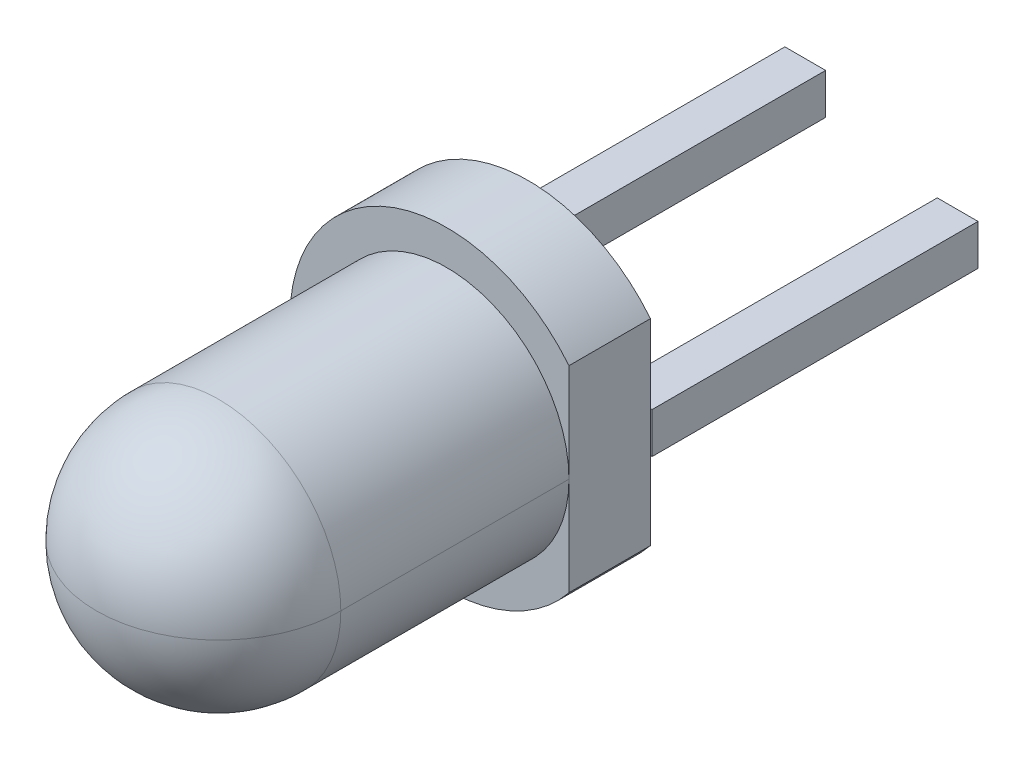
ISO-10303-21;
HEADER;
FILE_DESCRIPTION(('STEP AP214'),'2;1');
FILE_NAME('part.step','',(''),(''),'','','');
FILE_SCHEMA(('AUTOMOTIVE_DESIGN { 1 0 10303 214 1 1 1 1 }'));
ENDSEC;
DATA;
#1=APPLICATION_CONTEXT('core data for automotive mechanical design processes');
#2=APPLICATION_PROTOCOL_DEFINITION('international standard','automotive_design',2000,#1);
#3=PRODUCT_CONTEXT('',#1,'mechanical');
#4=PRODUCT('Part','Part','',(#3));
#5=PRODUCT_RELATED_PRODUCT_CATEGORY('part','',(#4));
#6=PRODUCT_DEFINITION_FORMATION('','',#4);
#7=PRODUCT_DEFINITION_CONTEXT('part definition',#1,'design');
#8=PRODUCT_DEFINITION('design','',#6,#7);
#9=PRODUCT_DEFINITION_SHAPE('','',#8);
#10=(LENGTH_UNIT() NAMED_UNIT(*) SI_UNIT(.MILLI.,.METRE.));
#11=(NAMED_UNIT(*) PLANE_ANGLE_UNIT() SI_UNIT($,.RADIAN.));
#12=(NAMED_UNIT(*) SI_UNIT($,.STERADIAN.) SOLID_ANGLE_UNIT());
#13=UNCERTAINTY_MEASURE_WITH_UNIT(LENGTH_MEASURE(1.E-05),#10,'distance_accuracy_value','');
#14=(GEOMETRIC_REPRESENTATION_CONTEXT(3) GLOBAL_UNCERTAINTY_ASSIGNED_CONTEXT((#13)) GLOBAL_UNIT_ASSIGNED_CONTEXT((#10,
#11,#12)) REPRESENTATION_CONTEXT('',''));
#15=CARTESIAN_POINT('',(0.,0.,0.));
#16=DIRECTION('',(0.,0.,1.));
#17=DIRECTION('',(1.,0.,0.));
#18=AXIS2_PLACEMENT_3D('',#15,#16,#17);
#19=CARTESIAN_POINT('',(-0.895,-0.25,-4.67));
#20=DIRECTION('',(0.,0.,-1.));
#21=DIRECTION('',(0.,-1.,0.));
#22=AXIS2_PLACEMENT_3D('',#19,#20,#21);
#23=PLANE('',#22);
#24=DIRECTION('',(1.,0.,0.));
#25=VECTOR('',#24,1.);
#26=CARTESIAN_POINT('',(-0.895,-0.25,-4.67));
#27=LINE('',#26,#25);
#28=CARTESIAN_POINT('',(-1.52,-0.25,-4.67));
#29=VERTEX_POINT('',#28);
#30=CARTESIAN_POINT('',(-1.02,-0.25,-4.67));
#31=VERTEX_POINT('',#30);
#32=EDGE_CURVE('E153',#29,#31,#27,.T.);
#33=ORIENTED_EDGE('',*,*,#32,.F.);
#34=DIRECTION('',(0.,-1.,0.));
#35=VECTOR('',#34,1.);
#36=CARTESIAN_POINT('',(-1.52,0.25,-4.67));
#37=LINE('',#36,#35);
#38=CARTESIAN_POINT('',(-1.52,0.25,-4.67));
#39=VERTEX_POINT('',#38);
#40=EDGE_CURVE('E137',#39,#29,#37,.T.);
#41=ORIENTED_EDGE('',*,*,#40,.F.);
#42=DIRECTION('',(-1.,0.,0.));
#43=VECTOR('',#42,1.);
#44=CARTESIAN_POINT('',(-0.895,0.25,-4.67));
#45=LINE('',#44,#43);
#46=CARTESIAN_POINT('',(-1.02,0.25,-4.67));
#47=VERTEX_POINT('',#46);
#48=EDGE_CURVE('E196',#47,#39,#45,.T.);
#49=ORIENTED_EDGE('',*,*,#48,.F.);
#50=DIRECTION('',(0.,1.,0.));
#51=VECTOR('',#50,1.);
#52=CARTESIAN_POINT('',(-1.02,-0.25,-4.67));
#53=LINE('',#52,#51);
#54=EDGE_CURVE('E138',#31,#47,#53,.T.);
#55=ORIENTED_EDGE('',*,*,#54,.F.);
#56=EDGE_LOOP('',(#33,#41,#49,#55));
#57=FACE_BOUND('',#56,.T.);
#58=ADVANCED_FACE('F16',(#57),#23,.T.);
#59=CARTESIAN_POINT('',(0.,0.,-4.));
#60=DIRECTION('',(0.,0.,-1.));
#61=DIRECTION('',(0.,-1.,0.));
#62=AXIS2_PLACEMENT_3D('',#59,#60,#61);
#63=PLANE('',#62);
#64=DIRECTION('',(0.,-1.,0.));
#65=VECTOR('',#64,1.);
#66=CARTESIAN_POINT('',(1.52,0.25,-4.));
#67=LINE('',#66,#65);
#68=CARTESIAN_POINT('',(1.52,0.25,-4.));
#69=VERTEX_POINT('',#68);
#70=CARTESIAN_POINT('',(1.52,-0.25,-4.));
#71=VERTEX_POINT('',#70);
#72=EDGE_CURVE('E149',#69,#71,#67,.T.);
#73=ORIENTED_EDGE('',*,*,#72,.T.);
#74=DIRECTION('',(1.,0.,0.));
#75=VECTOR('',#74,1.);
#76=CARTESIAN_POINT('',(1.645,-0.25,-4.));
#77=LINE('',#76,#75);
#78=CARTESIAN_POINT('',(1.02,-0.25,-4.));
#79=VERTEX_POINT('',#78);
#80=EDGE_CURVE('E173',#79,#71,#77,.T.);
#81=ORIENTED_EDGE('',*,*,#80,.F.);
#82=DIRECTION('',(0.,1.,0.));
#83=VECTOR('',#82,1.);
#84=CARTESIAN_POINT('',(1.02,-0.25,-4.));
#85=LINE('',#84,#83);
#86=CARTESIAN_POINT('',(1.02,0.25,-4.));
#87=VERTEX_POINT('',#86);
#88=EDGE_CURVE('E215',#79,#87,#85,.T.);
#89=ORIENTED_EDGE('',*,*,#88,.T.);
#90=DIRECTION('',(1.,0.,0.));
#91=VECTOR('',#90,1.);
#92=CARTESIAN_POINT('',(1.02,0.25,-4.));
#93=LINE('',#92,#91);
#94=EDGE_CURVE('E216',#87,#69,#93,.T.);
#95=ORIENTED_EDGE('',*,*,#94,.T.);
#96=EDGE_LOOP('',(#73,#81,#89,#95));
#97=FACE_BOUND('',#96,.T.);
#98=ADVANCED_FACE('F329',(#97),#63,.T.);
#99=CARTESIAN_POINT('',(0.,0.,3.8));
#100=DIRECTION('',(0.,1.,0.));
#101=DIRECTION('',(1.,0.,0.));
#102=AXIS2_PLACEMENT_3D('',#99,#100,#101);
#103=SPHERICAL_SURFACE('',#102,1.5);
#104=CARTESIAN_POINT('',(0.,0.,3.8));
#105=DIRECTION('',(0.,1.,0.));
#106=DIRECTION('',(-1.,0.,0.));
#107=AXIS2_PLACEMENT_3D('',#104,#105,#106);
#108=CIRCLE('',#107,1.5);
#109=CARTESIAN_POINT('',(-1.5,0.,3.8));
#110=VERTEX_POINT('',#109);
#111=CARTESIAN_POINT('',(0.,0.,5.3));
#112=VERTEX_POINT('',#111);
#113=EDGE_CURVE('E182',#110,#112,#108,.T.);
#114=ORIENTED_EDGE('',*,*,#113,.F.);
#115=CARTESIAN_POINT('',(0.,0.,3.8));
#116=DIRECTION('',(0.,0.,-1.));
#117=DIRECTION('',(-1.,0.,0.));
#118=AXIS2_PLACEMENT_3D('',#115,#116,#117);
#119=CIRCLE('',#118,1.5);
#120=CARTESIAN_POINT('',(1.5,0.,3.8));
#121=VERTEX_POINT('',#120);
#122=EDGE_CURVE('E207',#121,#110,#119,.T.);
#123=ORIENTED_EDGE('',*,*,#122,.F.);
#124=CARTESIAN_POINT('',(0.,0.,3.8));
#125=DIRECTION('',(0.,-1.,0.));
#126=DIRECTION('',(0.,0.,-1.));
#127=AXIS2_PLACEMENT_3D('',#124,#125,#126);
#128=CIRCLE('',#127,1.5);
#129=EDGE_CURVE('E186',#121,#112,#128,.T.);
#130=ORIENTED_EDGE('',*,*,#129,.T.);
#131=EDGE_LOOP('',(#114,#123,#130));
#132=FACE_BOUND('',#131,.T.);
#133=ADVANCED_FACE('F374',(#132),#103,.T.);
#134=CARTESIAN_POINT('',(0.,0.,0.));
#135=DIRECTION('',(0.,0.,-1.));
#136=DIRECTION('',(0.,-1.,0.));
#137=AXIS2_PLACEMENT_3D('',#134,#135,#136);
#138=PLANE('',#137);
#139=DIRECTION('',(0.,-1.,0.));
#140=VECTOR('',#139,1.);
#141=CARTESIAN_POINT('',(-1.52,0.25,0.));
#142=LINE('',#141,#140);
#143=CARTESIAN_POINT('',(-1.52,0.25,0.));
#144=VERTEX_POINT('',#143);
#145=CARTESIAN_POINT('',(-1.52,-0.25,0.));
#146=VERTEX_POINT('',#145);
#147=EDGE_CURVE('E144',#144,#146,#142,.T.);
#148=ORIENTED_EDGE('',*,*,#147,.T.);
#149=DIRECTION('',(1.,0.,0.));
#150=VECTOR('',#149,1.);
#151=CARTESIAN_POINT('',(-1.52,-0.25,0.));
#152=LINE('',#151,#150);
#153=CARTESIAN_POINT('',(-1.02,-0.25,0.));
#154=VERTEX_POINT('',#153);
#155=EDGE_CURVE('E141',#146,#154,#152,.T.);
#156=ORIENTED_EDGE('',*,*,#155,.T.);
#157=DIRECTION('',(0.,1.,0.));
#158=VECTOR('',#157,1.);
#159=CARTESIAN_POINT('',(-1.02,-0.25,0.));
#160=LINE('',#159,#158);
#161=CARTESIAN_POINT('',(-1.02,0.25,0.));
#162=VERTEX_POINT('',#161);
#163=EDGE_CURVE('E125',#154,#162,#160,.T.);
#164=ORIENTED_EDGE('',*,*,#163,.T.);
#165=DIRECTION('',(-1.,0.,0.));
#166=VECTOR('',#165,1.);
#167=CARTESIAN_POINT('',(-1.02,0.25,0.));
#168=LINE('',#167,#166);
#169=EDGE_CURVE('E168',#162,#144,#168,.T.);
#170=ORIENTED_EDGE('',*,*,#169,.T.);
#171=EDGE_LOOP('',(#148,#156,#164,#170));
#172=FACE_BOUND('',#171,.T.);
#173=DIRECTION('',(1.,0.,0.));
#174=VECTOR('',#173,1.);
#175=CARTESIAN_POINT('',(1.02,0.25,0.));
#176=LINE('',#175,#174);
#177=CARTESIAN_POINT('',(1.02,0.25,0.));
#178=VERTEX_POINT('',#177);
#179=CARTESIAN_POINT('',(1.5,0.25,0.));
#180=VERTEX_POINT('',#179);
#181=EDGE_CURVE('E219',#178,#180,#176,.T.);
#182=ORIENTED_EDGE('',*,*,#181,.F.);
#183=DIRECTION('',(0.,1.,0.));
#184=VECTOR('',#183,1.);
#185=CARTESIAN_POINT('',(1.02,-0.25,0.));
#186=LINE('',#185,#184);
#187=CARTESIAN_POINT('',(1.02,-0.25,0.));
#188=VERTEX_POINT('',#187);
#189=EDGE_CURVE('E239',#188,#178,#186,.T.);
#190=ORIENTED_EDGE('',*,*,#189,.F.);
#191=DIRECTION('',(-1.,0.,0.));
#192=VECTOR('',#191,1.);
#193=CARTESIAN_POINT('',(1.52,-0.25,0.));
#194=LINE('',#193,#192);
#195=CARTESIAN_POINT('',(1.5,-0.25,0.));
#196=VERTEX_POINT('',#195);
#197=EDGE_CURVE('E206',#196,#188,#194,.T.);
#198=ORIENTED_EDGE('',*,*,#197,.F.);
#199=DIRECTION('',(0.,-1.,0.));
#200=VECTOR('',#199,1.);
#201=CARTESIAN_POINT('',(1.5,0.,0.));
#202=LINE('',#201,#200);
#203=CARTESIAN_POINT('',(1.5,-1.20649285120137,0.));
#204=VERTEX_POINT('',#203);
#205=EDGE_CURVE('E10',#196,#204,#202,.T.);
#206=ORIENTED_EDGE('',*,*,#205,.T.);
#207=CARTESIAN_POINT('',(0.,0.,0.));
#208=DIRECTION('',(0.,0.,-1.));
#209=DIRECTION('',(1.,0.,0.));
#210=AXIS2_PLACEMENT_3D('',#207,#208,#209);
#211=CIRCLE('',#210,1.925);
#212=CARTESIAN_POINT('',(-1.925,0.,0.));
#213=VERTEX_POINT('',#212);
#214=EDGE_CURVE('E230',#204,#213,#211,.T.);
#215=ORIENTED_EDGE('',*,*,#214,.T.);
#216=CARTESIAN_POINT('',(0.,0.,0.));
#217=DIRECTION('',(0.,0.,-1.));
#218=DIRECTION('',(1.,0.,0.));
#219=AXIS2_PLACEMENT_3D('',#216,#217,#218);
#220=CIRCLE('',#219,1.925);
#221=CARTESIAN_POINT('',(1.5,1.20649285120137,0.));
#222=VERTEX_POINT('',#221);
#223=EDGE_CURVE('E252',#213,#222,#220,.T.);
#224=ORIENTED_EDGE('',*,*,#223,.T.);
#225=DIRECTION('',(0.,-1.,0.));
#226=VECTOR('',#225,1.);
#227=CARTESIAN_POINT('',(1.5,0.,0.));
#228=LINE('',#227,#226);
#229=EDGE_CURVE('E27',#222,#180,#228,.T.);
#230=ORIENTED_EDGE('',*,*,#229,.T.);
#231=EDGE_LOOP('',(#182,#190,#198,#206,#215,#224,#230));
#232=FACE_BOUND('',#231,.T.);
#233=ADVANCED_FACE('F142',(#172,#232),#138,.T.);
#234=CARTESIAN_POINT('',(1.5,1.925,5.53579262617378));
#235=DIRECTION('',(1.,0.,0.));
#236=DIRECTION('',(0.,1.,0.));
#237=AXIS2_PLACEMENT_3D('',#234,#235,#236);
#238=PLANE('',#237);
#239=ORIENTED_EDGE('',*,*,#229,.F.);
#240=DIRECTION('',(0.,0.,-1.));
#241=VECTOR('',#240,1.);
#242=CARTESIAN_POINT('',(1.5,1.20649285120137,1.));
#243=LINE('',#242,#241);
#244=CARTESIAN_POINT('',(1.5,1.20649285120137,1.));
#245=VERTEX_POINT('',#244);
#246=EDGE_CURVE('E193',#245,#222,#243,.T.);
#247=ORIENTED_EDGE('',*,*,#246,.F.);
#248=DIRECTION('',(0.,-1.,0.));
#249=VECTOR('',#248,1.);
#250=CARTESIAN_POINT('',(1.5,0.,1.));
#251=LINE('',#250,#249);
#252=CARTESIAN_POINT('',(1.5,0.,1.));
#253=VERTEX_POINT('',#252);
#254=EDGE_CURVE('E226',#245,#253,#251,.T.);
#255=ORIENTED_EDGE('',*,*,#254,.T.);
#256=DIRECTION('',(0.,-1.,0.));
#257=VECTOR('',#256,1.);
#258=CARTESIAN_POINT('',(1.5,0.,1.));
#259=LINE('',#258,#257);
#260=CARTESIAN_POINT('',(1.5,-1.20649285120137,1.));
#261=VERTEX_POINT('',#260);
#262=EDGE_CURVE('E229',#253,#261,#259,.T.);
#263=ORIENTED_EDGE('',*,*,#262,.T.);
#264=DIRECTION('',(0.,0.,1.));
#265=VECTOR('',#264,1.);
#266=CARTESIAN_POINT('',(1.5,-1.20649285120137,1.));
#267=LINE('',#266,#265);
#268=EDGE_CURVE('E232',#204,#261,#267,.T.);
#269=ORIENTED_EDGE('',*,*,#268,.F.);
#270=ORIENTED_EDGE('',*,*,#205,.F.);
#271=DIRECTION('',(0.,-1.,0.));
#272=VECTOR('',#271,1.);
#273=CARTESIAN_POINT('',(1.5,0.,0.));
#274=LINE('',#273,#272);
#275=EDGE_CURVE('E221',#180,#196,#274,.T.);
#276=ORIENTED_EDGE('',*,*,#275,.F.);
#277=EDGE_LOOP('',(#239,#247,#255,#263,#269,#270,#276));
#278=FACE_BOUND('',#277,.T.);
#279=ADVANCED_FACE('F320',(#278),#238,.T.);
#280=CARTESIAN_POINT('',(0.,0.,1.));
#281=DIRECTION('',(0.,0.,1.));
#282=DIRECTION('',(-1.,0.,0.));
#283=AXIS2_PLACEMENT_3D('',#280,#281,#282);
#284=CYLINDRICAL_SURFACE('',#283,1.925);
#285=DIRECTION('',(0.,0.,1.));
#286=VECTOR('',#285,1.);
#287=CARTESIAN_POINT('',(-1.925,0.,1.));
#288=LINE('',#287,#286);
#289=CARTESIAN_POINT('',(-1.925,0.,1.));
#290=VERTEX_POINT('',#289);
#291=EDGE_CURVE('E248',#213,#290,#288,.T.);
#292=ORIENTED_EDGE('',*,*,#291,.F.);
#293=ORIENTED_EDGE('',*,*,#214,.F.);
#294=ORIENTED_EDGE('',*,*,#268,.T.);
#295=CARTESIAN_POINT('',(0.,0.,1.));
#296=DIRECTION('',(0.,0.,-1.));
#297=DIRECTION('',(1.,0.,0.));
#298=AXIS2_PLACEMENT_3D('',#295,#296,#297);
#299=CIRCLE('',#298,1.925);
#300=EDGE_CURVE('E20',#261,#290,#299,.T.);
#301=ORIENTED_EDGE('',*,*,#300,.T.);
#302=EDGE_LOOP('',(#292,#293,#294,#301));
#303=FACE_BOUND('',#302,.T.);
#304=ADVANCED_FACE('F380',(#303),#284,.T.);
#305=CARTESIAN_POINT('',(0.,0.,1.));
#306=DIRECTION('',(0.,0.,-1.));
#307=DIRECTION('',(0.,-1.,0.));
#308=AXIS2_PLACEMENT_3D('',#305,#306,#307);
#309=PLANE('',#308);
#310=ORIENTED_EDGE('',*,*,#262,.F.);
#311=CARTESIAN_POINT('',(0.,0.,1.));
#312=DIRECTION('',(0.,0.,-1.));
#313=DIRECTION('',(0.,1.,0.));
#314=AXIS2_PLACEMENT_3D('',#311,#312,#313);
#315=CIRCLE('',#314,1.5);
#316=CARTESIAN_POINT('',(-1.5,0.,1.));
#317=VERTEX_POINT('',#316);
#318=EDGE_CURVE('E188',#253,#317,#315,.T.);
#319=ORIENTED_EDGE('',*,*,#318,.T.);
#320=CARTESIAN_POINT('',(0.,0.,1.));
#321=DIRECTION('',(0.,0.,-1.));
#322=DIRECTION('',(0.,1.,0.));
#323=AXIS2_PLACEMENT_3D('',#320,#321,#322);
#324=CIRCLE('',#323,1.5);
#325=EDGE_CURVE('E225',#317,#253,#324,.T.);
#326=ORIENTED_EDGE('',*,*,#325,.T.);
#327=ORIENTED_EDGE('',*,*,#254,.F.);
#328=CARTESIAN_POINT('',(0.,0.,1.));
#329=DIRECTION('',(0.,0.,-1.));
#330=DIRECTION('',(1.,0.,0.));
#331=AXIS2_PLACEMENT_3D('',#328,#329,#330);
#332=CIRCLE('',#331,1.925);
#333=EDGE_CURVE('E165',#290,#245,#332,.T.);
#334=ORIENTED_EDGE('',*,*,#333,.F.);
#335=ORIENTED_EDGE('',*,*,#300,.F.);
#336=EDGE_LOOP('',(#310,#319,#326,#327,#334,#335));
#337=FACE_BOUND('',#336,.T.);
#338=ADVANCED_FACE('F382',(#337),#309,.F.);
#339=CARTESIAN_POINT('',(0.,0.,5.3));
#340=DIRECTION('',(0.,0.,1.));
#341=DIRECTION('',(-1.,0.,0.));
#342=AXIS2_PLACEMENT_3D('',#339,#340,#341);
#343=CYLINDRICAL_SURFACE('',#342,1.5);
#344=DIRECTION('',(0.,0.,1.));
#345=VECTOR('',#344,1.);
#346=CARTESIAN_POINT('',(1.5,0.,5.3));
#347=LINE('',#346,#345);
#348=EDGE_CURVE('E192',#253,#121,#347,.T.);
#349=ORIENTED_EDGE('',*,*,#348,.F.);
#350=ORIENTED_EDGE('',*,*,#325,.F.);
#351=DIRECTION('',(0.,0.,1.));
#352=VECTOR('',#351,1.);
#353=CARTESIAN_POINT('',(-1.5,0.,5.3));
#354=LINE('',#353,#352);
#355=EDGE_CURVE('E197',#317,#110,#354,.T.);
#356=ORIENTED_EDGE('',*,*,#355,.T.);
#357=CARTESIAN_POINT('',(0.,0.,3.8));
#358=DIRECTION('',(0.,0.,-1.));
#359=DIRECTION('',(-1.,0.,0.));
#360=AXIS2_PLACEMENT_3D('',#357,#358,#359);
#361=CIRCLE('',#360,1.5);
#362=EDGE_CURVE('E187',#110,#121,#361,.T.);
#363=ORIENTED_EDGE('',*,*,#362,.T.);
#364=EDGE_LOOP('',(#349,#350,#356,#363));
#365=FACE_BOUND('',#364,.T.);
#366=ADVANCED_FACE('F385',(#365),#343,.T.);
#367=CARTESIAN_POINT('',(1.52,-0.25,0.));
#368=DIRECTION('',(0.,0.,-1.));
#369=DIRECTION('',(0.,-1.,0.));
#370=AXIS2_PLACEMENT_3D('',#367,#368,#369);
#371=PLANE('',#370);
#372=DIRECTION('',(1.,0.,0.));
#373=VECTOR('',#372,1.);
#374=CARTESIAN_POINT('',(1.02,0.25,0.));
#375=LINE('',#374,#373);
#376=CARTESIAN_POINT('',(1.52,0.25,0.));
#377=VERTEX_POINT('',#376);
#378=EDGE_CURVE('E258',#180,#377,#375,.T.);
#379=ORIENTED_EDGE('',*,*,#378,.F.);
#380=ORIENTED_EDGE('',*,*,#275,.T.);
#381=DIRECTION('',(-1.,0.,0.));
#382=VECTOR('',#381,1.);
#383=CARTESIAN_POINT('',(1.52,-0.25,0.));
#384=LINE('',#383,#382);
#385=CARTESIAN_POINT('',(1.52,-0.25,0.));
#386=VERTEX_POINT('',#385);
#387=EDGE_CURVE('E202',#386,#196,#384,.T.);
#388=ORIENTED_EDGE('',*,*,#387,.F.);
#389=DIRECTION('',(0.,-1.,0.));
#390=VECTOR('',#389,1.);
#391=CARTESIAN_POINT('',(1.52,0.25,0.));
#392=LINE('',#391,#390);
#393=EDGE_CURVE('E174',#377,#386,#392,.T.);
#394=ORIENTED_EDGE('',*,*,#393,.F.);
#395=EDGE_LOOP('',(#379,#380,#388,#394));
#396=FACE_BOUND('',#395,.T.);
#397=ADVANCED_FACE('F323',(#396),#371,.F.);
#398=CARTESIAN_POINT('',(-1.52,0.25,-26.4));
#399=DIRECTION('',(-1.,0.,0.));
#400=DIRECTION('',(0.,0.,1.));
#401=AXIS2_PLACEMENT_3D('',#398,#399,#400);
#402=PLANE('',#401);
#403=DIRECTION('',(0.,0.,1.));
#404=VECTOR('',#403,1.);
#405=CARTESIAN_POINT('',(-1.52,0.25,-26.4));
#406=LINE('',#405,#404);
#407=EDGE_CURVE('E201',#39,#144,#406,.T.);
#408=ORIENTED_EDGE('',*,*,#407,.F.);
#409=ORIENTED_EDGE('',*,*,#40,.T.);
#410=DIRECTION('',(0.,0.,1.));
#411=VECTOR('',#410,1.);
#412=CARTESIAN_POINT('',(-1.52,-0.25,-26.4));
#413=LINE('',#412,#411);
#414=EDGE_CURVE('E161',#29,#146,#413,.T.);
#415=ORIENTED_EDGE('',*,*,#414,.T.);
#416=ORIENTED_EDGE('',*,*,#147,.F.);
#417=EDGE_LOOP('',(#408,#409,#415,#416));
#418=FACE_BOUND('',#417,.T.);
#419=ADVANCED_FACE('F352',(#418),#402,.T.);
#420=CARTESIAN_POINT('',(-1.02,-0.25,-26.4));
#421=DIRECTION('',(1.,0.,0.));
#422=DIRECTION('',(0.,1.,0.));
#423=AXIS2_PLACEMENT_3D('',#420,#421,#422);
#424=PLANE('',#423);
#425=DIRECTION('',(0.,0.,1.));
#426=VECTOR('',#425,1.);
#427=CARTESIAN_POINT('',(-1.02,-0.25,-26.4));
#428=LINE('',#427,#426);
#429=EDGE_CURVE('E129',#31,#154,#428,.T.);
#430=ORIENTED_EDGE('',*,*,#429,.F.);
#431=ORIENTED_EDGE('',*,*,#54,.T.);
#432=DIRECTION('',(0.,0.,1.));
#433=VECTOR('',#432,1.);
#434=CARTESIAN_POINT('',(-1.02,0.25,-26.4));
#435=LINE('',#434,#433);
#436=EDGE_CURVE('E132',#47,#162,#435,.T.);
#437=ORIENTED_EDGE('',*,*,#436,.T.);
#438=ORIENTED_EDGE('',*,*,#163,.F.);
#439=EDGE_LOOP('',(#430,#431,#437,#438));
#440=FACE_BOUND('',#439,.T.);
#441=ADVANCED_FACE('F127',(#440),#424,.T.);
#442=CARTESIAN_POINT('',(1.02,0.25,-26.4));
#443=DIRECTION('',(0.,-1.,0.));
#444=DIRECTION('',(0.,0.,-1.));
#445=AXIS2_PLACEMENT_3D('',#442,#443,#444);
#446=PLANE('',#445);
#447=ORIENTED_EDGE('',*,*,#94,.F.);
#448=DIRECTION('',(0.,0.,1.));
#449=VECTOR('',#448,1.);
#450=CARTESIAN_POINT('',(1.02,0.25,-26.4));
#451=LINE('',#450,#449);
#452=EDGE_CURVE('E220',#87,#178,#451,.T.);
#453=ORIENTED_EDGE('',*,*,#452,.T.);
#454=ORIENTED_EDGE('',*,*,#181,.T.);
#455=ORIENTED_EDGE('',*,*,#378,.T.);
#456=DIRECTION('',(0.,0.,1.));
#457=VECTOR('',#456,1.);
#458=CARTESIAN_POINT('',(1.52,0.25,-26.4));
#459=LINE('',#458,#457);
#460=EDGE_CURVE('E178',#69,#377,#459,.T.);
#461=ORIENTED_EDGE('',*,*,#460,.F.);
#462=EDGE_LOOP('',(#447,#453,#454,#455,#461));
#463=FACE_BOUND('',#462,.T.);
#464=ADVANCED_FACE('F310',(#463),#446,.F.);
#465=CARTESIAN_POINT('',(1.02,-0.25,-26.4));
#466=DIRECTION('',(1.,0.,0.));
#467=DIRECTION('',(0.,1.,0.));
#468=AXIS2_PLACEMENT_3D('',#465,#466,#467);
#469=PLANE('',#468);
#470=ORIENTED_EDGE('',*,*,#88,.F.);
#471=DIRECTION('',(0.,0.,1.));
#472=VECTOR('',#471,1.);
#473=CARTESIAN_POINT('',(1.02,-0.25,-26.4));
#474=LINE('',#473,#472);
#475=EDGE_CURVE('E211',#79,#188,#474,.T.);
#476=ORIENTED_EDGE('',*,*,#475,.T.);
#477=ORIENTED_EDGE('',*,*,#189,.T.);
#478=ORIENTED_EDGE('',*,*,#452,.F.);
#479=EDGE_LOOP('',(#470,#476,#477,#478));
#480=FACE_BOUND('',#479,.T.);
#481=ADVANCED_FACE('F313',(#480),#469,.F.);
#482=CARTESIAN_POINT('',(1.52,-0.25,-26.4));
#483=DIRECTION('',(0.,1.,0.));
#484=DIRECTION('',(1.,0.,0.));
#485=AXIS2_PLACEMENT_3D('',#482,#483,#484);
#486=PLANE('',#485);
#487=ORIENTED_EDGE('',*,*,#80,.T.);
#488=DIRECTION('',(0.,0.,1.));
#489=VECTOR('',#488,1.);
#490=CARTESIAN_POINT('',(1.52,-0.25,-26.4));
#491=LINE('',#490,#489);
#492=EDGE_CURVE('E169',#71,#386,#491,.T.);
#493=ORIENTED_EDGE('',*,*,#492,.T.);
#494=ORIENTED_EDGE('',*,*,#387,.T.);
#495=ORIENTED_EDGE('',*,*,#197,.T.);
#496=ORIENTED_EDGE('',*,*,#475,.F.);
#497=EDGE_LOOP('',(#487,#493,#494,#495,#496));
#498=FACE_BOUND('',#497,.T.);
#499=ADVANCED_FACE('F333',(#498),#486,.F.);
#500=CARTESIAN_POINT('',(1.52,0.25,-26.4));
#501=DIRECTION('',(-1.,0.,0.));
#502=DIRECTION('',(0.,0.,1.));
#503=AXIS2_PLACEMENT_3D('',#500,#501,#502);
#504=PLANE('',#503);
#505=ORIENTED_EDGE('',*,*,#72,.F.);
#506=ORIENTED_EDGE('',*,*,#460,.T.);
#507=ORIENTED_EDGE('',*,*,#393,.T.);
#508=ORIENTED_EDGE('',*,*,#492,.F.);
#509=EDGE_LOOP('',(#505,#506,#507,#508));
#510=FACE_BOUND('',#509,.T.);
#511=ADVANCED_FACE('F18',(#510),#504,.F.);
#512=CARTESIAN_POINT('',(-1.52,-0.25,-26.4));
#513=DIRECTION('',(0.,-1.,0.));
#514=DIRECTION('',(0.,0.,-1.));
#515=AXIS2_PLACEMENT_3D('',#512,#513,#514);
#516=PLANE('',#515);
#517=ORIENTED_EDGE('',*,*,#414,.F.);
#518=ORIENTED_EDGE('',*,*,#32,.T.);
#519=ORIENTED_EDGE('',*,*,#429,.T.);
#520=ORIENTED_EDGE('',*,*,#155,.F.);
#521=EDGE_LOOP('',(#517,#518,#519,#520));
#522=FACE_BOUND('',#521,.T.);
#523=ADVANCED_FACE('F151',(#522),#516,.T.);
#524=CARTESIAN_POINT('',(-1.02,0.25,-26.4));
#525=DIRECTION('',(0.,1.,0.));
#526=DIRECTION('',(1.,0.,0.));
#527=AXIS2_PLACEMENT_3D('',#524,#525,#526);
#528=PLANE('',#527);
#529=ORIENTED_EDGE('',*,*,#436,.F.);
#530=ORIENTED_EDGE('',*,*,#48,.T.);
#531=ORIENTED_EDGE('',*,*,#407,.T.);
#532=ORIENTED_EDGE('',*,*,#169,.F.);
#533=EDGE_LOOP('',(#529,#530,#531,#532));
#534=FACE_BOUND('',#533,.T.);
#535=ADVANCED_FACE('F354',(#534),#528,.T.);
#536=CARTESIAN_POINT('',(0.,0.,5.3));
#537=DIRECTION('',(0.,0.,1.));
#538=DIRECTION('',(-1.,0.,0.));
#539=AXIS2_PLACEMENT_3D('',#536,#537,#538);
#540=CYLINDRICAL_SURFACE('',#539,1.5);
#541=ORIENTED_EDGE('',*,*,#318,.F.);
#542=ORIENTED_EDGE('',*,*,#348,.T.);
#543=ORIENTED_EDGE('',*,*,#122,.T.);
#544=ORIENTED_EDGE('',*,*,#355,.F.);
#545=EDGE_LOOP('',(#541,#542,#543,#544));
#546=FACE_BOUND('',#545,.T.);
#547=ADVANCED_FACE('F356',(#546),#540,.T.);
#548=CARTESIAN_POINT('',(0.,0.,1.));
#549=DIRECTION('',(0.,0.,1.));
#550=DIRECTION('',(-1.,0.,0.));
#551=AXIS2_PLACEMENT_3D('',#548,#549,#550);
#552=CYLINDRICAL_SURFACE('',#551,1.925);
#553=ORIENTED_EDGE('',*,*,#223,.F.);
#554=ORIENTED_EDGE('',*,*,#291,.T.);
#555=ORIENTED_EDGE('',*,*,#333,.T.);
#556=ORIENTED_EDGE('',*,*,#246,.T.);
#557=EDGE_LOOP('',(#553,#554,#555,#556));
#558=FACE_BOUND('',#557,.T.);
#559=ADVANCED_FACE('F363',(#558),#552,.T.);
#560=CARTESIAN_POINT('',(0.,0.,3.8));
#561=DIRECTION('',(0.,1.,0.));
#562=DIRECTION('',(1.,0.,0.));
#563=AXIS2_PLACEMENT_3D('',#560,#561,#562);
#564=SPHERICAL_SURFACE('',#563,1.5);
#565=ORIENTED_EDGE('',*,*,#362,.F.);
#566=ORIENTED_EDGE('',*,*,#113,.T.);
#567=ORIENTED_EDGE('',*,*,#129,.F.);
#568=EDGE_LOOP('',(#565,#566,#567));
#569=FACE_BOUND('',#568,.T.);
#570=ADVANCED_FACE('F396',(#569),#564,.T.);
#571=CLOSED_SHELL('',(#58,#98,#133,#233,#279,#304,#338,#366,#397,#419,#441,#464,#481,#499,#511,
#523,#535,#547,#559,#570));
#572=MANIFOLD_SOLID_BREP('B1',#571);
#573=ADVANCED_BREP_SHAPE_REPRESENTATION('',(#18,#572),#14);
#574=SHAPE_DEFINITION_REPRESENTATION(#9,#573);
ENDSEC;
END-ISO-10303-21;
